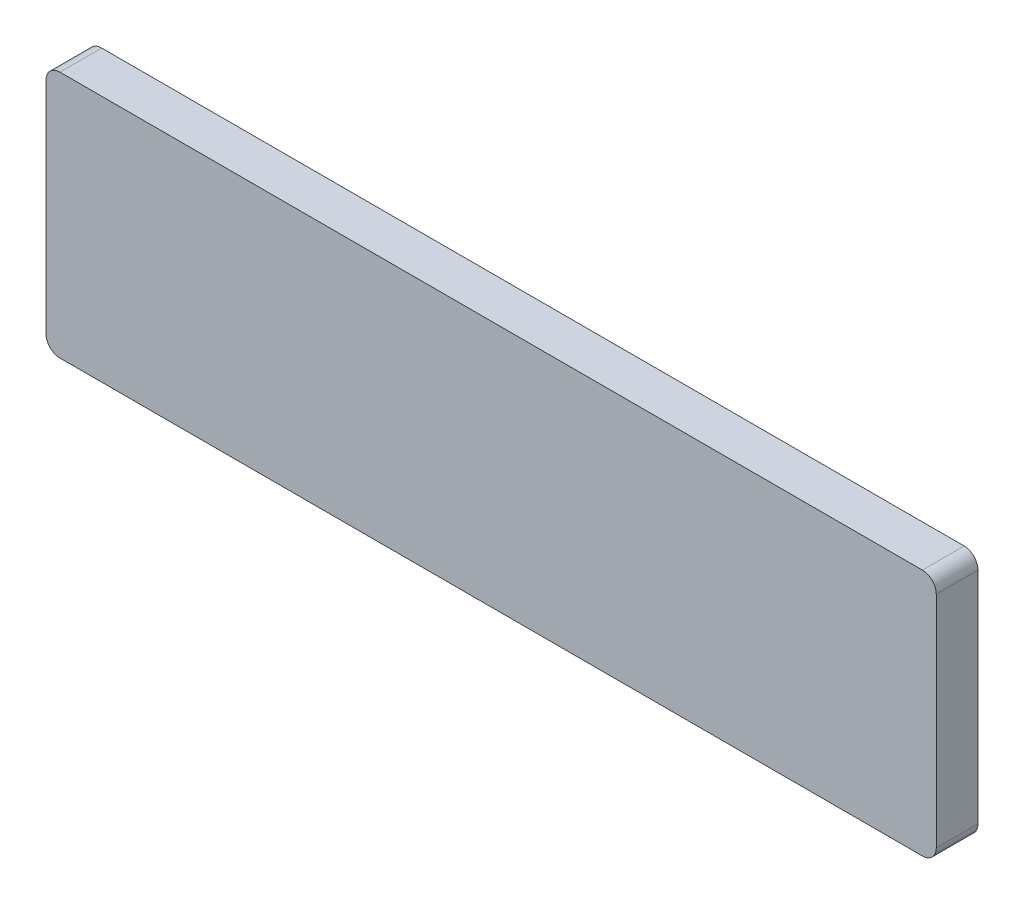
ISO-10303-21;
HEADER;
FILE_DESCRIPTION(('STEP AP214'),'2;1');
FILE_NAME('part.step','',(''),(''),'','','');
FILE_SCHEMA(('AUTOMOTIVE_DESIGN { 1 0 10303 214 1 1 1 1 }'));
ENDSEC;
DATA;
#1=APPLICATION_CONTEXT('core data for automotive mechanical design processes');
#2=APPLICATION_PROTOCOL_DEFINITION('international standard','automotive_design',2000,#1);
#3=PRODUCT_CONTEXT('',#1,'mechanical');
#4=PRODUCT('Part','Part','',(#3));
#5=PRODUCT_RELATED_PRODUCT_CATEGORY('part','',(#4));
#6=PRODUCT_DEFINITION_FORMATION('','',#4);
#7=PRODUCT_DEFINITION_CONTEXT('part definition',#1,'design');
#8=PRODUCT_DEFINITION('design','',#6,#7);
#9=PRODUCT_DEFINITION_SHAPE('','',#8);
#10=(LENGTH_UNIT() NAMED_UNIT(*) SI_UNIT(.MILLI.,.METRE.));
#11=(NAMED_UNIT(*) PLANE_ANGLE_UNIT() SI_UNIT($,.RADIAN.));
#12=(NAMED_UNIT(*) SI_UNIT($,.STERADIAN.) SOLID_ANGLE_UNIT());
#13=UNCERTAINTY_MEASURE_WITH_UNIT(LENGTH_MEASURE(1.E-05),#10,'distance_accuracy_value','');
#14=(GEOMETRIC_REPRESENTATION_CONTEXT(3) GLOBAL_UNCERTAINTY_ASSIGNED_CONTEXT((#13)) GLOBAL_UNIT_ASSIGNED_CONTEXT((#10,
#11,#12)) REPRESENTATION_CONTEXT('',''));
#15=CARTESIAN_POINT('',(0.,0.,0.));
#16=DIRECTION('',(0.,0.,1.));
#17=DIRECTION('',(1.,0.,0.));
#18=AXIS2_PLACEMENT_3D('',#15,#16,#17);
#19=CARTESIAN_POINT('',(155.,39.5,7.5));
#20=DIRECTION('',(0.,0.,-1.));
#21=DIRECTION('',(-1.,0.,0.));
#22=AXIS2_PLACEMENT_3D('',#19,#20,#21);
#23=CYLINDRICAL_SURFACE('',#22,5.);
#24=CARTESIAN_POINT('',(155.,39.5,-7.5));
#25=DIRECTION('',(0.,0.,1.));
#26=DIRECTION('',(-1.,0.,0.));
#27=AXIS2_PLACEMENT_3D('',#24,#25,#26);
#28=CIRCLE('',#27,5.);
#29=CARTESIAN_POINT('',(160.,39.5,-7.5));
#30=VERTEX_POINT('',#29);
#31=CARTESIAN_POINT('',(155.,44.5,-7.5));
#32=VERTEX_POINT('',#31);
#33=EDGE_CURVE('E140',#30,#32,#28,.T.);
#34=ORIENTED_EDGE('',*,*,#33,.T.);
#35=DIRECTION('',(0.,0.,-1.));
#36=VECTOR('',#35,1.);
#37=CARTESIAN_POINT('',(155.,44.5,7.5));
#38=LINE('',#37,#36);
#39=CARTESIAN_POINT('',(155.,44.5,7.5));
#40=VERTEX_POINT('',#39);
#41=EDGE_CURVE('E11',#40,#32,#38,.T.);
#42=ORIENTED_EDGE('',*,*,#41,.F.);
#43=CARTESIAN_POINT('',(155.,39.5,7.5));
#44=DIRECTION('',(0.,0.,1.));
#45=DIRECTION('',(-1.,0.,0.));
#46=AXIS2_PLACEMENT_3D('',#43,#44,#45);
#47=CIRCLE('',#46,5.);
#48=CARTESIAN_POINT('',(160.,39.5,7.5));
#49=VERTEX_POINT('',#48);
#50=EDGE_CURVE('E162',#49,#40,#47,.T.);
#51=ORIENTED_EDGE('',*,*,#50,.F.);
#52=DIRECTION('',(0.,0.,-1.));
#53=VECTOR('',#52,1.);
#54=CARTESIAN_POINT('',(160.,39.5,7.5));
#55=LINE('',#54,#53);
#56=EDGE_CURVE('E136',#49,#30,#55,.T.);
#57=ORIENTED_EDGE('',*,*,#56,.T.);
#58=EDGE_LOOP('',(#34,#42,#51,#57));
#59=FACE_BOUND('',#58,.T.);
#60=ADVANCED_FACE('F39',(#59),#23,.T.);
#61=CARTESIAN_POINT('',(-155.,44.5,7.5));
#62=DIRECTION('',(0.,-1.,0.));
#63=DIRECTION('',(0.,0.,-1.));
#64=AXIS2_PLACEMENT_3D('',#61,#62,#63);
#65=PLANE('',#64);
#66=DIRECTION('',(-1.,0.,0.));
#67=VECTOR('',#66,1.);
#68=CARTESIAN_POINT('',(-155.,44.5,-7.5));
#69=LINE('',#68,#67);
#70=CARTESIAN_POINT('',(-155.,44.5,-7.5));
#71=VERTEX_POINT('',#70);
#72=EDGE_CURVE('E144',#32,#71,#69,.T.);
#73=ORIENTED_EDGE('',*,*,#72,.T.);
#74=DIRECTION('',(0.,0.,-1.));
#75=VECTOR('',#74,1.);
#76=CARTESIAN_POINT('',(-155.,44.5,7.5));
#77=LINE('',#76,#75);
#78=CARTESIAN_POINT('',(-155.,44.5,7.5));
#79=VERTEX_POINT('',#78);
#80=EDGE_CURVE('E48',#79,#71,#77,.T.);
#81=ORIENTED_EDGE('',*,*,#80,.F.);
#82=DIRECTION('',(-1.,0.,0.));
#83=VECTOR('',#82,1.);
#84=CARTESIAN_POINT('',(-155.,44.5,7.5));
#85=LINE('',#84,#83);
#86=EDGE_CURVE('E99',#40,#79,#85,.T.);
#87=ORIENTED_EDGE('',*,*,#86,.F.);
#88=ORIENTED_EDGE('',*,*,#41,.T.);
#89=EDGE_LOOP('',(#73,#81,#87,#88));
#90=FACE_BOUND('',#89,.T.);
#91=ADVANCED_FACE('F208',(#90),#65,.F.);
#92=CARTESIAN_POINT('',(-155.,39.5,7.5));
#93=DIRECTION('',(0.,0.,-1.));
#94=DIRECTION('',(-1.,0.,0.));
#95=AXIS2_PLACEMENT_3D('',#92,#93,#94);
#96=CYLINDRICAL_SURFACE('',#95,5.);
#97=CARTESIAN_POINT('',(-155.,39.5,-7.5));
#98=DIRECTION('',(0.,0.,1.));
#99=DIRECTION('',(1.,0.,0.));
#100=AXIS2_PLACEMENT_3D('',#97,#98,#99);
#101=CIRCLE('',#100,5.);
#102=CARTESIAN_POINT('',(-160.,39.5,-7.5));
#103=VERTEX_POINT('',#102);
#104=EDGE_CURVE('E147',#71,#103,#101,.T.);
#105=ORIENTED_EDGE('',*,*,#104,.T.);
#106=DIRECTION('',(0.,0.,-1.));
#107=VECTOR('',#106,1.);
#108=CARTESIAN_POINT('',(-160.,39.5,7.5));
#109=LINE('',#108,#107);
#110=CARTESIAN_POINT('',(-160.,39.5,7.5));
#111=VERTEX_POINT('',#110);
#112=EDGE_CURVE('E173',#111,#103,#109,.T.);
#113=ORIENTED_EDGE('',*,*,#112,.F.);
#114=CARTESIAN_POINT('',(-155.,39.5,7.5));
#115=DIRECTION('',(0.,0.,1.));
#116=DIRECTION('',(1.,0.,0.));
#117=AXIS2_PLACEMENT_3D('',#114,#115,#116);
#118=CIRCLE('',#117,5.);
#119=EDGE_CURVE('E183',#79,#111,#118,.T.);
#120=ORIENTED_EDGE('',*,*,#119,.F.);
#121=ORIENTED_EDGE('',*,*,#80,.T.);
#122=EDGE_LOOP('',(#105,#113,#120,#121));
#123=FACE_BOUND('',#122,.T.);
#124=ADVANCED_FACE('F181',(#123),#96,.T.);
#125=CARTESIAN_POINT('',(-160.,39.5,7.5));
#126=DIRECTION('',(1.,0.,0.));
#127=DIRECTION('',(0.,0.,-1.));
#128=AXIS2_PLACEMENT_3D('',#125,#126,#127);
#129=PLANE('',#128);
#130=DIRECTION('',(0.,-1.,0.));
#131=VECTOR('',#130,1.);
#132=CARTESIAN_POINT('',(-160.,39.5,-7.5));
#133=LINE('',#132,#131);
#134=CARTESIAN_POINT('',(-160.,-39.5,-7.5));
#135=VERTEX_POINT('',#134);
#136=EDGE_CURVE('E150',#103,#135,#133,.T.);
#137=ORIENTED_EDGE('',*,*,#136,.T.);
#138=DIRECTION('',(0.,0.,-1.));
#139=VECTOR('',#138,1.);
#140=CARTESIAN_POINT('',(-160.,-39.5,7.5));
#141=LINE('',#140,#139);
#142=CARTESIAN_POINT('',(-160.,-39.5,7.5));
#143=VERTEX_POINT('',#142);
#144=EDGE_CURVE('E169',#143,#135,#141,.T.);
#145=ORIENTED_EDGE('',*,*,#144,.F.);
#146=DIRECTION('',(0.,-1.,0.));
#147=VECTOR('',#146,1.);
#148=CARTESIAN_POINT('',(-160.,39.5,7.5));
#149=LINE('',#148,#147);
#150=EDGE_CURVE('E196',#111,#143,#149,.T.);
#151=ORIENTED_EDGE('',*,*,#150,.F.);
#152=ORIENTED_EDGE('',*,*,#112,.T.);
#153=EDGE_LOOP('',(#137,#145,#151,#152));
#154=FACE_BOUND('',#153,.T.);
#155=ADVANCED_FACE('F191',(#154),#129,.F.);
#156=CARTESIAN_POINT('',(-155.,-39.5,7.5));
#157=DIRECTION('',(0.,0.,-1.));
#158=DIRECTION('',(-1.,0.,0.));
#159=AXIS2_PLACEMENT_3D('',#156,#157,#158);
#160=CYLINDRICAL_SURFACE('',#159,5.);
#161=CARTESIAN_POINT('',(-155.,-39.5,-7.5));
#162=DIRECTION('',(0.,0.,1.));
#163=DIRECTION('',(1.,0.,0.));
#164=AXIS2_PLACEMENT_3D('',#161,#162,#163);
#165=CIRCLE('',#164,5.);
#166=CARTESIAN_POINT('',(-155.,-44.5,-7.5));
#167=VERTEX_POINT('',#166);
#168=EDGE_CURVE('E153',#135,#167,#165,.T.);
#169=ORIENTED_EDGE('',*,*,#168,.T.);
#170=DIRECTION('',(0.,0.,-1.));
#171=VECTOR('',#170,1.);
#172=CARTESIAN_POINT('',(-155.,-44.5,7.5));
#173=LINE('',#172,#171);
#174=CARTESIAN_POINT('',(-155.,-44.5,7.5));
#175=VERTEX_POINT('',#174);
#176=EDGE_CURVE('E129',#175,#167,#173,.T.);
#177=ORIENTED_EDGE('',*,*,#176,.F.);
#178=CARTESIAN_POINT('',(-155.,-39.5,7.5));
#179=DIRECTION('',(0.,0.,1.));
#180=DIRECTION('',(1.,0.,0.));
#181=AXIS2_PLACEMENT_3D('',#178,#179,#180);
#182=CIRCLE('',#181,5.);
#183=EDGE_CURVE('E118',#143,#175,#182,.T.);
#184=ORIENTED_EDGE('',*,*,#183,.F.);
#185=ORIENTED_EDGE('',*,*,#144,.T.);
#186=EDGE_LOOP('',(#169,#177,#184,#185));
#187=FACE_BOUND('',#186,.T.);
#188=ADVANCED_FACE('F194',(#187),#160,.T.);
#189=CARTESIAN_POINT('',(-155.,-44.5,7.5));
#190=DIRECTION('',(0.,1.,0.));
#191=DIRECTION('',(0.,0.,1.));
#192=AXIS2_PLACEMENT_3D('',#189,#190,#191);
#193=PLANE('',#192);
#194=DIRECTION('',(1.,0.,0.));
#195=VECTOR('',#194,1.);
#196=CARTESIAN_POINT('',(-155.,-44.5,-7.5));
#197=LINE('',#196,#195);
#198=CARTESIAN_POINT('',(155.,-44.5,-7.5));
#199=VERTEX_POINT('',#198);
#200=EDGE_CURVE('E127',#167,#199,#197,.T.);
#201=ORIENTED_EDGE('',*,*,#200,.T.);
#202=DIRECTION('',(0.,0.,-1.));
#203=VECTOR('',#202,1.);
#204=CARTESIAN_POINT('',(155.,-44.5,7.5));
#205=LINE('',#204,#203);
#206=CARTESIAN_POINT('',(155.,-44.5,7.5));
#207=VERTEX_POINT('',#206);
#208=EDGE_CURVE('E124',#207,#199,#205,.T.);
#209=ORIENTED_EDGE('',*,*,#208,.F.);
#210=DIRECTION('',(1.,0.,0.));
#211=VECTOR('',#210,1.);
#212=CARTESIAN_POINT('',(-155.,-44.5,7.5));
#213=LINE('',#212,#211);
#214=EDGE_CURVE('E112',#175,#207,#213,.T.);
#215=ORIENTED_EDGE('',*,*,#214,.F.);
#216=ORIENTED_EDGE('',*,*,#176,.T.);
#217=EDGE_LOOP('',(#201,#209,#215,#216));
#218=FACE_BOUND('',#217,.T.);
#219=ADVANCED_FACE('F125',(#218),#193,.F.);
#220=CARTESIAN_POINT('',(155.,-39.5,7.5));
#221=DIRECTION('',(0.,0.,-1.));
#222=DIRECTION('',(-1.,0.,0.));
#223=AXIS2_PLACEMENT_3D('',#220,#221,#222);
#224=CYLINDRICAL_SURFACE('',#223,5.);
#225=CARTESIAN_POINT('',(155.,-39.5,-7.5));
#226=DIRECTION('',(0.,0.,1.));
#227=DIRECTION('',(1.,0.,0.));
#228=AXIS2_PLACEMENT_3D('',#225,#226,#227);
#229=CIRCLE('',#228,5.);
#230=CARTESIAN_POINT('',(160.,-39.5,-7.5));
#231=VERTEX_POINT('',#230);
#232=EDGE_CURVE('E85',#199,#231,#229,.T.);
#233=ORIENTED_EDGE('',*,*,#232,.T.);
#234=DIRECTION('',(0.,0.,-1.));
#235=VECTOR('',#234,1.);
#236=CARTESIAN_POINT('',(160.,-39.5,7.5));
#237=LINE('',#236,#235);
#238=CARTESIAN_POINT('',(160.,-39.5,7.5));
#239=VERTEX_POINT('',#238);
#240=EDGE_CURVE('E130',#239,#231,#237,.T.);
#241=ORIENTED_EDGE('',*,*,#240,.F.);
#242=CARTESIAN_POINT('',(155.,-39.5,7.5));
#243=DIRECTION('',(0.,0.,1.));
#244=DIRECTION('',(1.,0.,0.));
#245=AXIS2_PLACEMENT_3D('',#242,#243,#244);
#246=CIRCLE('',#245,5.);
#247=EDGE_CURVE('E116',#207,#239,#246,.T.);
#248=ORIENTED_EDGE('',*,*,#247,.F.);
#249=ORIENTED_EDGE('',*,*,#208,.T.);
#250=EDGE_LOOP('',(#233,#241,#248,#249));
#251=FACE_BOUND('',#250,.T.);
#252=ADVANCED_FACE('F132',(#251),#224,.T.);
#253=CARTESIAN_POINT('',(160.,39.5,7.5));
#254=DIRECTION('',(-1.,0.,0.));
#255=DIRECTION('',(0.,0.,1.));
#256=AXIS2_PLACEMENT_3D('',#253,#254,#255);
#257=PLANE('',#256);
#258=DIRECTION('',(0.,1.,0.));
#259=VECTOR('',#258,1.);
#260=CARTESIAN_POINT('',(160.,39.5,-7.5));
#261=LINE('',#260,#259);
#262=EDGE_CURVE('E91',#231,#30,#261,.T.);
#263=ORIENTED_EDGE('',*,*,#262,.T.);
#264=ORIENTED_EDGE('',*,*,#56,.F.);
#265=DIRECTION('',(0.,1.,0.));
#266=VECTOR('',#265,1.);
#267=CARTESIAN_POINT('',(160.,39.5,7.5));
#268=LINE('',#267,#266);
#269=EDGE_CURVE('E56',#239,#49,#268,.T.);
#270=ORIENTED_EDGE('',*,*,#269,.F.);
#271=ORIENTED_EDGE('',*,*,#240,.T.);
#272=EDGE_LOOP('',(#263,#264,#270,#271));
#273=FACE_BOUND('',#272,.T.);
#274=ADVANCED_FACE('F224',(#273),#257,.F.);
#275=CARTESIAN_POINT('',(155.,39.5,7.5));
#276=DIRECTION('',(0.,0.,-1.));
#277=DIRECTION('',(-1.,0.,0.));
#278=AXIS2_PLACEMENT_3D('',#275,#276,#277);
#279=PLANE('',#278);
#280=ORIENTED_EDGE('',*,*,#50,.T.);
#281=ORIENTED_EDGE('',*,*,#86,.T.);
#282=ORIENTED_EDGE('',*,*,#119,.T.);
#283=ORIENTED_EDGE('',*,*,#150,.T.);
#284=ORIENTED_EDGE('',*,*,#183,.T.);
#285=ORIENTED_EDGE('',*,*,#214,.T.);
#286=ORIENTED_EDGE('',*,*,#247,.T.);
#287=ORIENTED_EDGE('',*,*,#269,.T.);
#288=EDGE_LOOP('',(#280,#281,#282,#283,#284,#285,#286,#287));
#289=FACE_BOUND('',#288,.T.);
#290=ADVANCED_FACE('F114',(#289),#279,.F.);
#291=CARTESIAN_POINT('',(155.,39.5,-7.5));
#292=DIRECTION('',(0.,0.,-1.));
#293=DIRECTION('',(-1.,0.,0.));
#294=AXIS2_PLACEMENT_3D('',#291,#292,#293);
#295=PLANE('',#294);
#296=ORIENTED_EDGE('',*,*,#33,.F.);
#297=ORIENTED_EDGE('',*,*,#262,.F.);
#298=ORIENTED_EDGE('',*,*,#232,.F.);
#299=ORIENTED_EDGE('',*,*,#200,.F.);
#300=ORIENTED_EDGE('',*,*,#168,.F.);
#301=ORIENTED_EDGE('',*,*,#136,.F.);
#302=ORIENTED_EDGE('',*,*,#104,.F.);
#303=ORIENTED_EDGE('',*,*,#72,.F.);
#304=EDGE_LOOP('',(#296,#297,#298,#299,#300,#301,#302,#303));
#305=FACE_BOUND('',#304,.T.);
#306=ADVANCED_FACE('F187',(#305),#295,.T.);
#307=CLOSED_SHELL('',(#60,#91,#124,#155,#188,#219,#252,#274,#290,#306));
#308=MANIFOLD_SOLID_BREP('B2',#307);
#309=ADVANCED_BREP_SHAPE_REPRESENTATION('',(#18,#308),#14);
#310=SHAPE_DEFINITION_REPRESENTATION(#9,#309);
ENDSEC;
END-ISO-10303-21;
